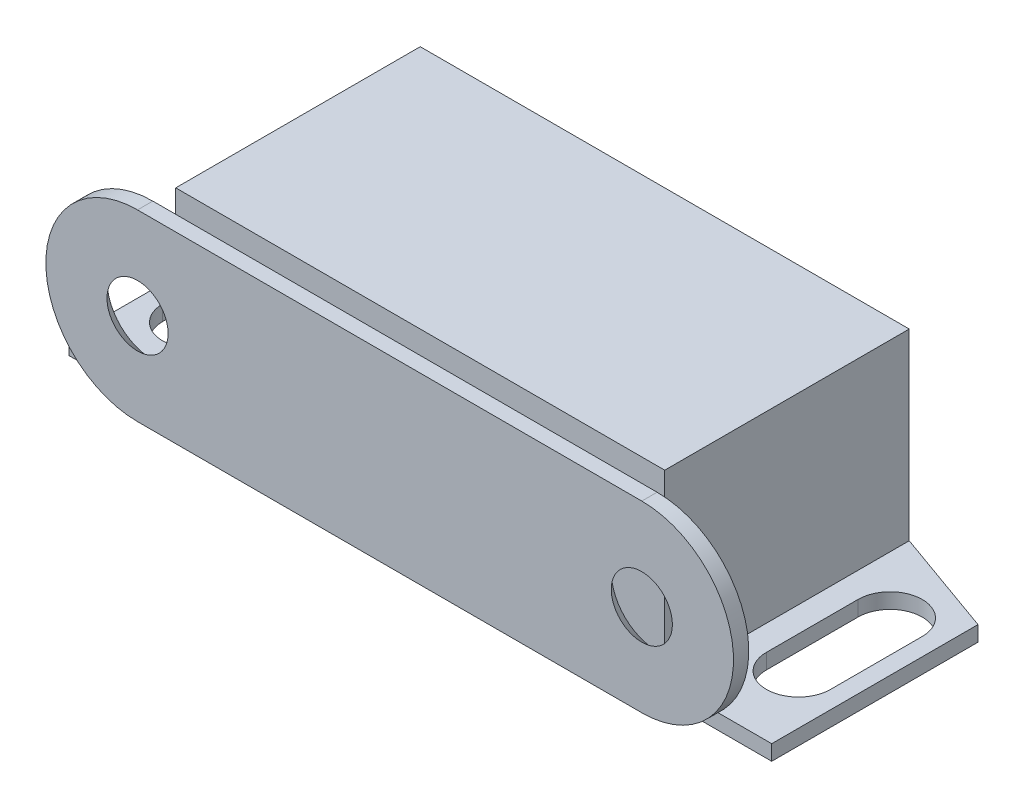
ISO-10303-21;
HEADER;
FILE_DESCRIPTION(('STEP AP214'),'2;1');
FILE_NAME('part.step','',(''),(''),'','','');
FILE_SCHEMA(('AUTOMOTIVE_DESIGN { 1 0 10303 214 1 1 1 1 }'));
ENDSEC;
DATA;
#1=APPLICATION_CONTEXT('core data for automotive mechanical design processes');
#2=APPLICATION_PROTOCOL_DEFINITION('international standard','automotive_design',2000,#1);
#3=PRODUCT_CONTEXT('',#1,'mechanical');
#4=PRODUCT('Part','Part','',(#3));
#5=PRODUCT_RELATED_PRODUCT_CATEGORY('part','',(#4));
#6=PRODUCT_DEFINITION_FORMATION('','',#4);
#7=PRODUCT_DEFINITION_CONTEXT('part definition',#1,'design');
#8=PRODUCT_DEFINITION('design','',#6,#7);
#9=PRODUCT_DEFINITION_SHAPE('','',#8);
#10=(LENGTH_UNIT() NAMED_UNIT(*) SI_UNIT(.MILLI.,.METRE.));
#11=(NAMED_UNIT(*) PLANE_ANGLE_UNIT() SI_UNIT($,.RADIAN.));
#12=(NAMED_UNIT(*) SI_UNIT($,.STERADIAN.) SOLID_ANGLE_UNIT());
#13=UNCERTAINTY_MEASURE_WITH_UNIT(LENGTH_MEASURE(1.E-05),#10,'distance_accuracy_value','');
#14=(GEOMETRIC_REPRESENTATION_CONTEXT(3) GLOBAL_UNCERTAINTY_ASSIGNED_CONTEXT((#13)) GLOBAL_UNIT_ASSIGNED_CONTEXT((#10,
#11,#12)) REPRESENTATION_CONTEXT('',''));
#15=CARTESIAN_POINT('',(0.,0.,0.));
#16=DIRECTION('',(0.,0.,1.));
#17=DIRECTION('',(1.,0.,0.));
#18=AXIS2_PLACEMENT_3D('',#15,#16,#17);
#19=CARTESIAN_POINT('',(6.5,6.5,2.));
#20=DIRECTION('',(0.,0.,1.));
#21=DIRECTION('',(1.,0.,0.));
#22=AXIS2_PLACEMENT_3D('',#19,#20,#21);
#23=PLANE('',#22);
#24=CARTESIAN_POINT('',(6.5,6.5,2.));
#25=DIRECTION('',(0.,0.,1.));
#26=DIRECTION('',(1.,0.,0.));
#27=AXIS2_PLACEMENT_3D('',#24,#25,#26);
#28=CIRCLE('',#27,2.);
#29=CARTESIAN_POINT('',(8.5,6.5,2.));
#30=VERTEX_POINT('',#29);
#31=EDGE_CURVE('E127',#30,#30,#28,.T.);
#32=ORIENTED_EDGE('',*,*,#31,.F.);
#33=EDGE_LOOP('',(#32));
#34=FACE_BOUND('',#33,.T.);
#35=CARTESIAN_POINT('',(6.5,6.5,2.));
#36=DIRECTION('',(0.,0.,1.));
#37=DIRECTION('',(1.,0.,0.));
#38=AXIS2_PLACEMENT_3D('',#35,#36,#37);
#39=CIRCLE('',#38,6.);
#40=CARTESIAN_POINT('',(6.5,12.5,2.));
#41=VERTEX_POINT('',#40);
#42=CARTESIAN_POINT('',(6.5,0.499999999999999,2.));
#43=VERTEX_POINT('',#42);
#44=EDGE_CURVE('E109',#41,#43,#39,.T.);
#45=ORIENTED_EDGE('',*,*,#44,.T.);
#46=DIRECTION('',(1.,0.,0.));
#47=VECTOR('',#46,1.);
#48=CARTESIAN_POINT('',(6.5,0.499999999999999,2.));
#49=LINE('',#48,#47);
#50=CARTESIAN_POINT('',(39.5,0.500000000000001,2.));
#51=VERTEX_POINT('',#50);
#52=EDGE_CURVE('E104',#43,#51,#49,.T.);
#53=ORIENTED_EDGE('',*,*,#52,.T.);
#54=CARTESIAN_POINT('',(39.5,6.5,2.));
#55=DIRECTION('',(0.,0.,1.));
#56=DIRECTION('',(1.,0.,0.));
#57=AXIS2_PLACEMENT_3D('',#54,#55,#56);
#58=CIRCLE('',#57,6.);
#59=CARTESIAN_POINT('',(39.5,12.5,2.));
#60=VERTEX_POINT('',#59);
#61=EDGE_CURVE('E107',#51,#60,#58,.T.);
#62=ORIENTED_EDGE('',*,*,#61,.T.);
#63=DIRECTION('',(-1.,0.,0.));
#64=VECTOR('',#63,1.);
#65=CARTESIAN_POINT('',(6.5,12.5,2.));
#66=LINE('',#65,#64);
#67=EDGE_CURVE('E73',#60,#41,#66,.T.);
#68=ORIENTED_EDGE('',*,*,#67,.T.);
#69=EDGE_LOOP('',(#45,#53,#62,#68));
#70=FACE_BOUND('',#69,.T.);
#71=CARTESIAN_POINT('',(39.5,6.5,2.));
#72=DIRECTION('',(0.,0.,1.));
#73=DIRECTION('',(1.,0.,0.));
#74=AXIS2_PLACEMENT_3D('',#71,#72,#73);
#75=CIRCLE('',#74,2.);
#76=CARTESIAN_POINT('',(41.5,6.5,2.));
#77=VERTEX_POINT('',#76);
#78=EDGE_CURVE('E178',#77,#77,#75,.T.);
#79=ORIENTED_EDGE('',*,*,#78,.F.);
#80=EDGE_LOOP('',(#79));
#81=FACE_BOUND('',#80,.T.);
#82=ADVANCED_FACE('F55',(#34,#70,#81),#23,.T.);
#83=CARTESIAN_POINT('',(6.5,6.5,1.));
#84=DIRECTION('',(0.,0.,1.));
#85=DIRECTION('',(1.,0.,0.));
#86=AXIS2_PLACEMENT_3D('',#83,#84,#85);
#87=PLANE('',#86);
#88=CARTESIAN_POINT('',(6.5,6.5,1.));
#89=DIRECTION('',(0.,0.,1.));
#90=DIRECTION('',(1.,0.,0.));
#91=AXIS2_PLACEMENT_3D('',#88,#89,#90);
#92=CIRCLE('',#91,3.);
#93=CARTESIAN_POINT('',(9.5,6.5,1.));
#94=VERTEX_POINT('',#93);
#95=EDGE_CURVE('E12',#94,#94,#92,.T.);
#96=ORIENTED_EDGE('',*,*,#95,.T.);
#97=EDGE_LOOP('',(#96));
#98=FACE_BOUND('',#97,.T.);
#99=CARTESIAN_POINT('',(39.5,6.5,1.));
#100=DIRECTION('',(0.,0.,1.));
#101=DIRECTION('',(1.,0.,0.));
#102=AXIS2_PLACEMENT_3D('',#99,#100,#101);
#103=CIRCLE('',#102,3.00000000000001);
#104=CARTESIAN_POINT('',(42.5,6.5,1.));
#105=VERTEX_POINT('',#104);
#106=EDGE_CURVE('E65',#105,#105,#103,.T.);
#107=ORIENTED_EDGE('',*,*,#106,.T.);
#108=EDGE_LOOP('',(#107));
#109=FACE_BOUND('',#108,.T.);
#110=CARTESIAN_POINT('',(6.5,6.5,1.));
#111=DIRECTION('',(0.,0.,1.));
#112=DIRECTION('',(1.,0.,0.));
#113=AXIS2_PLACEMENT_3D('',#110,#111,#112);
#114=CIRCLE('',#113,6.);
#115=CARTESIAN_POINT('',(6.5,12.5,1.));
#116=VERTEX_POINT('',#115);
#117=CARTESIAN_POINT('',(6.5,0.499999999999999,1.));
#118=VERTEX_POINT('',#117);
#119=EDGE_CURVE('E124',#116,#118,#114,.T.);
#120=ORIENTED_EDGE('',*,*,#119,.F.);
#121=DIRECTION('',(-1.,0.,0.));
#122=VECTOR('',#121,1.);
#123=CARTESIAN_POINT('',(6.5,12.5,1.));
#124=LINE('',#123,#122);
#125=CARTESIAN_POINT('',(39.5,12.5,1.));
#126=VERTEX_POINT('',#125);
#127=EDGE_CURVE('E96',#126,#116,#124,.T.);
#128=ORIENTED_EDGE('',*,*,#127,.F.);
#129=CARTESIAN_POINT('',(39.5,6.5,1.));
#130=DIRECTION('',(0.,0.,1.));
#131=DIRECTION('',(1.,0.,0.));
#132=AXIS2_PLACEMENT_3D('',#129,#130,#131);
#133=CIRCLE('',#132,6.);
#134=CARTESIAN_POINT('',(39.5,0.500000000000001,1.));
#135=VERTEX_POINT('',#134);
#136=EDGE_CURVE('E90',#135,#126,#133,.T.);
#137=ORIENTED_EDGE('',*,*,#136,.F.);
#138=DIRECTION('',(1.,0.,0.));
#139=VECTOR('',#138,1.);
#140=CARTESIAN_POINT('',(6.5,0.499999999999999,1.));
#141=LINE('',#140,#139);
#142=EDGE_CURVE('E114',#118,#135,#141,.T.);
#143=ORIENTED_EDGE('',*,*,#142,.F.);
#144=EDGE_LOOP('',(#120,#128,#137,#143));
#145=FACE_BOUND('',#144,.T.);
#146=ADVANCED_FACE('F136',(#98,#109,#145),#87,.F.);
#147=CARTESIAN_POINT('',(6.5,6.5,2.));
#148=DIRECTION('',(0.,0.,-1.));
#149=DIRECTION('',(-1.,0.,0.));
#150=AXIS2_PLACEMENT_3D('',#147,#148,#149);
#151=CYLINDRICAL_SURFACE('',#150,6.);
#152=ORIENTED_EDGE('',*,*,#119,.T.);
#153=DIRECTION('',(0.,0.,-1.));
#154=VECTOR('',#153,1.);
#155=CARTESIAN_POINT('',(6.5,0.499999999999999,2.));
#156=LINE('',#155,#154);
#157=EDGE_CURVE('E115',#43,#118,#156,.T.);
#158=ORIENTED_EDGE('',*,*,#157,.F.);
#159=ORIENTED_EDGE('',*,*,#44,.F.);
#160=DIRECTION('',(0.,0.,-1.));
#161=VECTOR('',#160,1.);
#162=CARTESIAN_POINT('',(6.5,12.5,2.));
#163=LINE('',#162,#161);
#164=EDGE_CURVE('E120',#41,#116,#163,.T.);
#165=ORIENTED_EDGE('',*,*,#164,.T.);
#166=EDGE_LOOP('',(#152,#158,#159,#165));
#167=FACE_BOUND('',#166,.T.);
#168=ADVANCED_FACE('F154',(#167),#151,.T.);
#169=CARTESIAN_POINT('',(6.5,0.499999999999999,2.));
#170=DIRECTION('',(0.,1.,0.));
#171=DIRECTION('',(-1.,0.,0.));
#172=AXIS2_PLACEMENT_3D('',#169,#170,#171);
#173=PLANE('',#172);
#174=ORIENTED_EDGE('',*,*,#142,.T.);
#175=DIRECTION('',(0.,0.,-1.));
#176=VECTOR('',#175,1.);
#177=CARTESIAN_POINT('',(39.5,0.500000000000001,2.));
#178=LINE('',#177,#176);
#179=EDGE_CURVE('E112',#51,#135,#178,.T.);
#180=ORIENTED_EDGE('',*,*,#179,.F.);
#181=ORIENTED_EDGE('',*,*,#52,.F.);
#182=ORIENTED_EDGE('',*,*,#157,.T.);
#183=EDGE_LOOP('',(#174,#180,#181,#182));
#184=FACE_BOUND('',#183,.T.);
#185=ADVANCED_FACE('F113',(#184),#173,.F.);
#186=CARTESIAN_POINT('',(39.5,6.5,2.));
#187=DIRECTION('',(0.,0.,-1.));
#188=DIRECTION('',(-1.,0.,0.));
#189=AXIS2_PLACEMENT_3D('',#186,#187,#188);
#190=CYLINDRICAL_SURFACE('',#189,6.);
#191=ORIENTED_EDGE('',*,*,#136,.T.);
#192=DIRECTION('',(0.,0.,-1.));
#193=VECTOR('',#192,1.);
#194=CARTESIAN_POINT('',(39.5,12.5,2.));
#195=LINE('',#194,#193);
#196=EDGE_CURVE('E116',#60,#126,#195,.T.);
#197=ORIENTED_EDGE('',*,*,#196,.F.);
#198=ORIENTED_EDGE('',*,*,#61,.F.);
#199=ORIENTED_EDGE('',*,*,#179,.T.);
#200=EDGE_LOOP('',(#191,#197,#198,#199));
#201=FACE_BOUND('',#200,.T.);
#202=ADVANCED_FACE('F118',(#201),#190,.T.);
#203=CARTESIAN_POINT('',(6.5,12.5,2.));
#204=DIRECTION('',(0.,-1.,0.));
#205=DIRECTION('',(1.,0.,0.));
#206=AXIS2_PLACEMENT_3D('',#203,#204,#205);
#207=PLANE('',#206);
#208=ORIENTED_EDGE('',*,*,#127,.T.);
#209=ORIENTED_EDGE('',*,*,#164,.F.);
#210=ORIENTED_EDGE('',*,*,#67,.F.);
#211=ORIENTED_EDGE('',*,*,#196,.T.);
#212=EDGE_LOOP('',(#208,#209,#210,#211));
#213=FACE_BOUND('',#212,.T.);
#214=ADVANCED_FACE('F145',(#213),#207,.F.);
#215=CARTESIAN_POINT('',(6.5,6.5,1.));
#216=DIRECTION('',(0.,0.,-1.));
#217=DIRECTION('',(-1.,0.,0.));
#218=AXIS2_PLACEMENT_3D('',#215,#216,#217);
#219=CONICAL_SURFACE('',#218,3.,0.785398163397446);
#220=ORIENTED_EDGE('',*,*,#31,.T.);
#221=EDGE_LOOP('',(#220));
#222=FACE_BOUND('',#221,.T.);
#223=ORIENTED_EDGE('',*,*,#95,.F.);
#224=EDGE_LOOP('',(#223));
#225=FACE_BOUND('',#224,.T.);
#226=ADVANCED_FACE('F140',(#222,#225),#219,.F.);
#227=CARTESIAN_POINT('',(39.5,6.5,1.));
#228=DIRECTION('',(0.,0.,-1.));
#229=DIRECTION('',(-1.,0.,0.));
#230=AXIS2_PLACEMENT_3D('',#227,#228,#229);
#231=CONICAL_SURFACE('',#230,3.00000000000001,0.785398163397443);
#232=ORIENTED_EDGE('',*,*,#78,.T.);
#233=EDGE_LOOP('',(#232));
#234=FACE_BOUND('',#233,.T.);
#235=ORIENTED_EDGE('',*,*,#106,.F.);
#236=EDGE_LOOP('',(#235));
#237=FACE_BOUND('',#236,.T.);
#238=ADVANCED_FACE('F58',(#234,#237),#231,.F.);
#239=CLOSED_SHELL('',(#82,#146,#168,#185,#202,#214,#226,#238));
#240=MANIFOLD_SOLID_BREP('B2',#239);
#241=CARTESIAN_POINT('',(0.,0.,0.));
#242=DIRECTION('',(0.,0.,1.));
#243=DIRECTION('',(1.,0.,0.));
#244=AXIS2_PLACEMENT_3D('',#241,#242,#243);
#245=PLANE('',#244);
#246=DIRECTION('',(1.,0.,0.));
#247=VECTOR('',#246,1.);
#248=CARTESIAN_POINT('',(0.,0.,0.));
#249=LINE('',#248,#247);
#250=CARTESIAN_POINT('',(0.,0.,0.));
#251=VERTEX_POINT('',#250);
#252=CARTESIAN_POINT('',(46.,0.,0.));
#253=VERTEX_POINT('',#252);
#254=EDGE_CURVE('E569',#251,#253,#249,.T.);
#255=ORIENTED_EDGE('',*,*,#254,.T.);
#256=DIRECTION('',(0.,-1.,0.));
#257=VECTOR('',#256,1.);
#258=CARTESIAN_POINT('',(46.,0.,0.));
#259=LINE('',#258,#257);
#260=CARTESIAN_POINT('',(46.,1.,0.));
#261=VERTEX_POINT('',#260);
#262=EDGE_CURVE('E589',#261,#253,#259,.T.);
#263=ORIENTED_EDGE('',*,*,#262,.F.);
#264=DIRECTION('',(1.,0.,0.));
#265=VECTOR('',#264,1.);
#266=CARTESIAN_POINT('',(0.,1.00000000000004,0.));
#267=LINE('',#266,#265);
#268=CARTESIAN_POINT('',(39.,1.00000000000001,0.));
#269=VERTEX_POINT('',#268);
#270=EDGE_CURVE('E593',#269,#261,#267,.T.);
#271=ORIENTED_EDGE('',*,*,#270,.F.);
#272=DIRECTION('',(0.,-1.,0.));
#273=VECTOR('',#272,1.);
#274=CARTESIAN_POINT('',(39.,0.,0.));
#275=LINE('',#274,#273);
#276=CARTESIAN_POINT('',(39.,13.,0.));
#277=VERTEX_POINT('',#276);
#278=EDGE_CURVE('E597',#277,#269,#275,.T.);
#279=ORIENTED_EDGE('',*,*,#278,.F.);
#280=DIRECTION('',(1.,0.,0.));
#281=VECTOR('',#280,1.);
#282=CARTESIAN_POINT('',(0.,13.,0.));
#283=LINE('',#282,#281);
#284=CARTESIAN_POINT('',(7.,13.,0.));
#285=VERTEX_POINT('',#284);
#286=EDGE_CURVE('E600',#285,#277,#283,.T.);
#287=ORIENTED_EDGE('',*,*,#286,.F.);
#288=DIRECTION('',(0.,1.,0.));
#289=VECTOR('',#288,1.);
#290=CARTESIAN_POINT('',(7.,0.,0.));
#291=LINE('',#290,#289);
#292=CARTESIAN_POINT('',(7.,1.,0.));
#293=VERTEX_POINT('',#292);
#294=EDGE_CURVE('E603',#293,#285,#291,.T.);
#295=ORIENTED_EDGE('',*,*,#294,.F.);
#296=DIRECTION('',(1.,0.,0.));
#297=VECTOR('',#296,1.);
#298=CARTESIAN_POINT('',(0.,1.,0.));
#299=LINE('',#298,#297);
#300=CARTESIAN_POINT('',(0.,1.,0.));
#301=VERTEX_POINT('',#300);
#302=EDGE_CURVE('E606',#301,#293,#299,.T.);
#303=ORIENTED_EDGE('',*,*,#302,.F.);
#304=DIRECTION('',(0.,1.,0.));
#305=VECTOR('',#304,1.);
#306=CARTESIAN_POINT('',(0.,0.,0.));
#307=LINE('',#306,#305);
#308=EDGE_CURVE('E575',#251,#301,#307,.T.);
#309=ORIENTED_EDGE('',*,*,#308,.F.);
#310=EDGE_LOOP('',(#255,#263,#271,#279,#287,#295,#303,#309));
#311=FACE_BOUND('',#310,.T.);
#312=DIRECTION('',(-1.,0.,0.));
#313=VECTOR('',#312,1.);
#314=CARTESIAN_POINT('',(12.,10.,0.));
#315=LINE('',#314,#313);
#316=CARTESIAN_POINT('',(34.,10.,0.));
#317=VERTEX_POINT('',#316);
#318=CARTESIAN_POINT('',(12.,10.,0.));
#319=VERTEX_POINT('',#318);
#320=EDGE_CURVE('E429',#317,#319,#315,.T.);
#321=ORIENTED_EDGE('',*,*,#320,.F.);
#322=DIRECTION('',(0.,1.,0.));
#323=VECTOR('',#322,1.);
#324=CARTESIAN_POINT('',(34.,9.,0.));
#325=LINE('',#324,#323);
#326=CARTESIAN_POINT('',(34.,9.,0.));
#327=VERTEX_POINT('',#326);
#328=EDGE_CURVE('E424',#327,#317,#325,.T.);
#329=ORIENTED_EDGE('',*,*,#328,.F.);
#330=DIRECTION('',(1.,0.,0.));
#331=VECTOR('',#330,1.);
#332=CARTESIAN_POINT('',(12.,9.,0.));
#333=LINE('',#332,#331);
#334=CARTESIAN_POINT('',(12.,9.,0.));
#335=VERTEX_POINT('',#334);
#336=EDGE_CURVE('E439',#335,#327,#333,.T.);
#337=ORIENTED_EDGE('',*,*,#336,.F.);
#338=DIRECTION('',(0.,-1.,0.));
#339=VECTOR('',#338,1.);
#340=CARTESIAN_POINT('',(12.,9.,0.));
#341=LINE('',#340,#339);
#342=EDGE_CURVE('E451',#319,#335,#341,.T.);
#343=ORIENTED_EDGE('',*,*,#342,.F.);
#344=EDGE_LOOP('',(#321,#329,#337,#343));
#345=FACE_BOUND('',#344,.T.);
#346=DIRECTION('',(-1.,0.,0.));
#347=VECTOR('',#346,1.);
#348=CARTESIAN_POINT('',(12.,5.,0.));
#349=LINE('',#348,#347);
#350=CARTESIAN_POINT('',(34.,5.,0.));
#351=VERTEX_POINT('',#350);
#352=CARTESIAN_POINT('',(12.,5.,0.));
#353=VERTEX_POINT('',#352);
#354=EDGE_CURVE('E1013',#351,#353,#349,.T.);
#355=ORIENTED_EDGE('',*,*,#354,.F.);
#356=DIRECTION('',(0.,1.,0.));
#357=VECTOR('',#356,1.);
#358=CARTESIAN_POINT('',(34.,4.,0.));
#359=LINE('',#358,#357);
#360=CARTESIAN_POINT('',(34.,4.,0.));
#361=VERTEX_POINT('',#360);
#362=EDGE_CURVE('E421',#361,#351,#359,.T.);
#363=ORIENTED_EDGE('',*,*,#362,.F.);
#364=DIRECTION('',(1.,0.,0.));
#365=VECTOR('',#364,1.);
#366=CARTESIAN_POINT('',(12.,4.,0.));
#367=LINE('',#366,#365);
#368=CARTESIAN_POINT('',(12.,4.,0.));
#369=VERTEX_POINT('',#368);
#370=EDGE_CURVE('E417',#369,#361,#367,.T.);
#371=ORIENTED_EDGE('',*,*,#370,.F.);
#372=DIRECTION('',(0.,-1.,0.));
#373=VECTOR('',#372,1.);
#374=CARTESIAN_POINT('',(12.,4.,0.));
#375=LINE('',#374,#373);
#376=EDGE_CURVE('E1009',#353,#369,#375,.T.);
#377=ORIENTED_EDGE('',*,*,#376,.F.);
#378=EDGE_LOOP('',(#355,#363,#371,#377));
#379=FACE_BOUND('',#378,.T.);
#380=ADVANCED_FACE('F227',(#311,#345,#379),#245,.T.);
#381=CARTESIAN_POINT('',(0.,0.,-16.));
#382=DIRECTION('',(0.,-1.,0.));
#383=DIRECTION('',(0.,0.,-1.));
#384=AXIS2_PLACEMENT_3D('',#381,#382,#383);
#385=PLANE('',#384);
#386=DIRECTION('',(-0.941741911594838,0.,-0.336336396998156));
#387=VECTOR('',#386,1.);
#388=CARTESIAN_POINT('',(4.41176470588234,0.,-28.3529411764706));
#389=LINE('',#388,#387);
#390=CARTESIAN_POINT('',(46.,0.,-13.5));
#391=VERTEX_POINT('',#390);
#392=CARTESIAN_POINT('',(39.,0.,-16.));
#393=VERTEX_POINT('',#392);
#394=EDGE_CURVE('E484',#391,#393,#389,.T.);
#395=ORIENTED_EDGE('',*,*,#394,.F.);
#396=DIRECTION('',(0.,0.,1.));
#397=VECTOR('',#396,1.);
#398=CARTESIAN_POINT('',(46.,0.,-16.));
#399=LINE('',#398,#397);
#400=EDGE_CURVE('E585',#391,#253,#399,.T.);
#401=ORIENTED_EDGE('',*,*,#400,.T.);
#402=ORIENTED_EDGE('',*,*,#254,.F.);
#403=DIRECTION('',(0.,0.,1.));
#404=VECTOR('',#403,1.);
#405=CARTESIAN_POINT('',(0.,0.,-16.));
#406=LINE('',#405,#404);
#407=CARTESIAN_POINT('',(0.,0.,-13.5));
#408=VERTEX_POINT('',#407);
#409=EDGE_CURVE('E612',#408,#251,#406,.T.);
#410=ORIENTED_EDGE('',*,*,#409,.F.);
#411=DIRECTION('',(-0.941741911594838,0.,0.336336396998156));
#412=VECTOR('',#411,1.);
#413=CARTESIAN_POINT('',(0.791855203619906,0.,-13.7828054298643));
#414=LINE('',#413,#412);
#415=CARTESIAN_POINT('',(6.99999999999999,0.,-16.));
#416=VERTEX_POINT('',#415);
#417=EDGE_CURVE('E477',#416,#408,#414,.T.);
#418=ORIENTED_EDGE('',*,*,#417,.F.);
#419=DIRECTION('',(1.,0.,0.));
#420=VECTOR('',#419,1.);
#421=CARTESIAN_POINT('',(0.,0.,-16.));
#422=LINE('',#421,#420);
#423=EDGE_CURVE('E570',#416,#393,#422,.T.);
#424=ORIENTED_EDGE('',*,*,#423,.T.);
#425=EDGE_LOOP('',(#395,#401,#402,#410,#418,#424));
#426=FACE_BOUND('',#425,.T.);
#427=CARTESIAN_POINT('',(42.75,0.,-5.));
#428=DIRECTION('',(0.,-1.,0.));
#429=DIRECTION('',(0.,0.,-1.));
#430=AXIS2_PLACEMENT_3D('',#427,#428,#429);
#431=CIRCLE('',#430,2.1);
#432=CARTESIAN_POINT('',(44.85,0.,-5.));
#433=VERTEX_POINT('',#432);
#434=CARTESIAN_POINT('',(40.65,0.,-5.));
#435=VERTEX_POINT('',#434);
#436=EDGE_CURVE('E553',#433,#435,#431,.T.);
#437=ORIENTED_EDGE('',*,*,#436,.F.);
#438=DIRECTION('',(0.,0.,1.));
#439=VECTOR('',#438,1.);
#440=CARTESIAN_POINT('',(44.85,0.,-16.));
#441=LINE('',#440,#439);
#442=CARTESIAN_POINT('',(44.85,0.,-11.));
#443=VERTEX_POINT('',#442);
#444=EDGE_CURVE('E508',#443,#433,#441,.T.);
#445=ORIENTED_EDGE('',*,*,#444,.F.);
#446=CARTESIAN_POINT('',(42.75,0.,-11.));
#447=DIRECTION('',(0.,-1.,0.));
#448=DIRECTION('',(0.,0.,-1.));
#449=AXIS2_PLACEMENT_3D('',#446,#447,#448);
#450=CIRCLE('',#449,2.1);
#451=CARTESIAN_POINT('',(40.65,0.,-11.));
#452=VERTEX_POINT('',#451);
#453=EDGE_CURVE('E546',#452,#443,#450,.T.);
#454=ORIENTED_EDGE('',*,*,#453,.F.);
#455=DIRECTION('',(0.,0.,-1.));
#456=VECTOR('',#455,1.);
#457=CARTESIAN_POINT('',(40.65,0.,-16.));
#458=LINE('',#457,#456);
#459=EDGE_CURVE('E550',#435,#452,#458,.T.);
#460=ORIENTED_EDGE('',*,*,#459,.F.);
#461=EDGE_LOOP('',(#437,#445,#454,#460));
#462=FACE_BOUND('',#461,.T.);
#463=CARTESIAN_POINT('',(3.24999999999999,0.,-5.));
#464=DIRECTION('',(0.,-1.,0.));
#465=DIRECTION('',(0.,0.,-1.));
#466=AXIS2_PLACEMENT_3D('',#463,#464,#465);
#467=CIRCLE('',#466,2.1);
#468=CARTESIAN_POINT('',(5.34999999999999,0.,-5.));
#469=VERTEX_POINT('',#468);
#470=CARTESIAN_POINT('',(1.14999999999999,0.,-5.));
#471=VERTEX_POINT('',#470);
#472=EDGE_CURVE('E566',#469,#471,#467,.T.);
#473=ORIENTED_EDGE('',*,*,#472,.F.);
#474=DIRECTION('',(0.,0.,1.));
#475=VECTOR('',#474,1.);
#476=CARTESIAN_POINT('',(5.34999999999999,0.,-16.));
#477=LINE('',#476,#475);
#478=CARTESIAN_POINT('',(5.34999999999999,0.,-11.));
#479=VERTEX_POINT('',#478);
#480=EDGE_CURVE('E556',#479,#469,#477,.T.);
#481=ORIENTED_EDGE('',*,*,#480,.F.);
#482=CARTESIAN_POINT('',(3.24999999999999,0.,-11.));
#483=DIRECTION('',(0.,-1.,0.));
#484=DIRECTION('',(0.,0.,-1.));
#485=AXIS2_PLACEMENT_3D('',#482,#483,#484);
#486=CIRCLE('',#485,2.1);
#487=CARTESIAN_POINT('',(1.14999999999999,0.,-11.));
#488=VERTEX_POINT('',#487);
#489=EDGE_CURVE('E559',#488,#479,#486,.T.);
#490=ORIENTED_EDGE('',*,*,#489,.F.);
#491=DIRECTION('',(0.,0.,-1.));
#492=VECTOR('',#491,1.);
#493=CARTESIAN_POINT('',(1.14999999999999,0.,-16.));
#494=LINE('',#493,#492);
#495=EDGE_CURVE('E563',#471,#488,#494,.T.);
#496=ORIENTED_EDGE('',*,*,#495,.F.);
#497=EDGE_LOOP('',(#473,#481,#490,#496));
#498=FACE_BOUND('',#497,.T.);
#499=ADVANCED_FACE('F229',(#426,#462,#498),#385,.T.);
#500=CARTESIAN_POINT('',(0.,0.,-16.));
#501=DIRECTION('',(1.,0.,0.));
#502=DIRECTION('',(0.,0.,-1.));
#503=AXIS2_PLACEMENT_3D('',#500,#501,#502);
#504=PLANE('',#503);
#505=DIRECTION('',(0.,0.,1.));
#506=VECTOR('',#505,1.);
#507=CARTESIAN_POINT('',(0.,1.,-16.));
#508=LINE('',#507,#506);
#509=CARTESIAN_POINT('',(0.,1.00000000000004,-13.5));
#510=VERTEX_POINT('',#509);
#511=EDGE_CURVE('E615',#510,#301,#508,.T.);
#512=ORIENTED_EDGE('',*,*,#511,.F.);
#513=DIRECTION('',(0.,1.,0.));
#514=VECTOR('',#513,1.);
#515=CARTESIAN_POINT('',(0.,-15.,-13.5));
#516=LINE('',#515,#514);
#517=EDGE_CURVE('E473',#408,#510,#516,.T.);
#518=ORIENTED_EDGE('',*,*,#517,.F.);
#519=ORIENTED_EDGE('',*,*,#409,.T.);
#520=ORIENTED_EDGE('',*,*,#308,.T.);
#521=EDGE_LOOP('',(#512,#518,#519,#520));
#522=FACE_BOUND('',#521,.T.);
#523=ADVANCED_FACE('F688',(#522),#504,.F.);
#524=CARTESIAN_POINT('',(0.,1.,-16.));
#525=DIRECTION('',(0.,-1.,0.));
#526=DIRECTION('',(0.,0.,-1.));
#527=AXIS2_PLACEMENT_3D('',#524,#525,#526);
#528=PLANE('',#527);
#529=DIRECTION('',(0.,0.,-1.));
#530=VECTOR('',#529,1.);
#531=CARTESIAN_POINT('',(5.34999999999999,1.00000000000003,-5.));
#532=LINE('',#531,#530);
#533=CARTESIAN_POINT('',(5.34999999999999,1.,-5.));
#534=VERTEX_POINT('',#533);
#535=CARTESIAN_POINT('',(5.34999999999999,1.00000000000003,-11.));
#536=VERTEX_POINT('',#535);
#537=EDGE_CURVE('E520',#534,#536,#532,.T.);
#538=ORIENTED_EDGE('',*,*,#537,.F.);
#539=CARTESIAN_POINT('',(3.24999999999999,1.00000000000003,-5.));
#540=DIRECTION('',(0.,1.,0.));
#541=DIRECTION('',(1.,0.,0.));
#542=AXIS2_PLACEMENT_3D('',#539,#540,#541);
#543=CIRCLE('',#542,2.1);
#544=CARTESIAN_POINT('',(1.14999999999999,1.00000000000004,-5.));
#545=VERTEX_POINT('',#544);
#546=EDGE_CURVE('E487',#545,#534,#543,.T.);
#547=ORIENTED_EDGE('',*,*,#546,.F.);
#548=DIRECTION('',(0.,0.,1.));
#549=VECTOR('',#548,1.);
#550=CARTESIAN_POINT('',(1.14999999999999,1.00000000000004,-5.));
#551=LINE('',#550,#549);
#552=CARTESIAN_POINT('',(1.14999999999999,1.00000000000004,-11.));
#553=VERTEX_POINT('',#552);
#554=EDGE_CURVE('E528',#553,#545,#551,.T.);
#555=ORIENTED_EDGE('',*,*,#554,.F.);
#556=CARTESIAN_POINT('',(3.24999999999999,1.00000000000003,-11.));
#557=DIRECTION('',(0.,1.,0.));
#558=DIRECTION('',(1.,0.,0.));
#559=AXIS2_PLACEMENT_3D('',#556,#557,#558);
#560=CIRCLE('',#559,2.1);
#561=EDGE_CURVE('E524',#536,#553,#560,.T.);
#562=ORIENTED_EDGE('',*,*,#561,.F.);
#563=EDGE_LOOP('',(#538,#547,#555,#562));
#564=FACE_BOUND('',#563,.T.);
#565=DIRECTION('',(0.,0.,1.));
#566=VECTOR('',#565,1.);
#567=CARTESIAN_POINT('',(7.,1.,-16.));
#568=LINE('',#567,#566);
#569=CARTESIAN_POINT('',(7.,1.,-16.));
#570=VERTEX_POINT('',#569);
#571=EDGE_CURVE('E618',#570,#293,#568,.T.);
#572=ORIENTED_EDGE('',*,*,#571,.F.);
#573=DIRECTION('',(0.941741911594838,0.,-0.336336396998156));
#574=VECTOR('',#573,1.);
#575=CARTESIAN_POINT('',(6.99999999999999,1.00000000000003,-16.));
#576=LINE('',#575,#574);
#577=EDGE_CURVE('E468',#510,#570,#576,.T.);
#578=ORIENTED_EDGE('',*,*,#577,.F.);
#579=ORIENTED_EDGE('',*,*,#511,.T.);
#580=ORIENTED_EDGE('',*,*,#302,.T.);
#581=EDGE_LOOP('',(#572,#578,#579,#580));
#582=FACE_BOUND('',#581,.T.);
#583=ADVANCED_FACE('F650',(#564,#582),#528,.F.);
#584=CARTESIAN_POINT('',(7.,0.,-16.));
#585=DIRECTION('',(1.,0.,0.));
#586=DIRECTION('',(0.,0.,-1.));
#587=AXIS2_PLACEMENT_3D('',#584,#585,#586);
#588=PLANE('',#587);
#589=ORIENTED_EDGE('',*,*,#294,.T.);
#590=DIRECTION('',(0.,0.,1.));
#591=VECTOR('',#590,1.);
#592=CARTESIAN_POINT('',(7.,13.,-16.));
#593=LINE('',#592,#591);
#594=CARTESIAN_POINT('',(7.,13.,-16.));
#595=VERTEX_POINT('',#594);
#596=EDGE_CURVE('E622',#595,#285,#593,.T.);
#597=ORIENTED_EDGE('',*,*,#596,.F.);
#598=DIRECTION('',(0.,1.,0.));
#599=VECTOR('',#598,1.);
#600=CARTESIAN_POINT('',(7.,0.,-16.));
#601=LINE('',#600,#599);
#602=EDGE_CURVE('E582',#570,#595,#601,.T.);
#603=ORIENTED_EDGE('',*,*,#602,.F.);
#604=ORIENTED_EDGE('',*,*,#571,.T.);
#605=EDGE_LOOP('',(#589,#597,#603,#604));
#606=FACE_BOUND('',#605,.T.);
#607=ADVANCED_FACE('F655',(#606),#588,.F.);
#608=CARTESIAN_POINT('',(0.,13.,-16.));
#609=DIRECTION('',(0.,-1.,0.));
#610=DIRECTION('',(1.,0.,0.));
#611=AXIS2_PLACEMENT_3D('',#608,#609,#610);
#612=PLANE('',#611);
#613=ORIENTED_EDGE('',*,*,#286,.T.);
#614=DIRECTION('',(0.,0.,1.));
#615=VECTOR('',#614,1.);
#616=CARTESIAN_POINT('',(39.,13.,-16.));
#617=LINE('',#616,#615);
#618=CARTESIAN_POINT('',(39.,13.,-16.));
#619=VERTEX_POINT('',#618);
#620=EDGE_CURVE('E626',#619,#277,#617,.T.);
#621=ORIENTED_EDGE('',*,*,#620,.F.);
#622=DIRECTION('',(1.,0.,0.));
#623=VECTOR('',#622,1.);
#624=CARTESIAN_POINT('',(0.,13.,-16.));
#625=LINE('',#624,#623);
#626=EDGE_CURVE('E579',#595,#619,#625,.T.);
#627=ORIENTED_EDGE('',*,*,#626,.F.);
#628=ORIENTED_EDGE('',*,*,#596,.T.);
#629=EDGE_LOOP('',(#613,#621,#627,#628));
#630=FACE_BOUND('',#629,.T.);
#631=ADVANCED_FACE('F660',(#630),#612,.F.);
#632=CARTESIAN_POINT('',(39.,0.,-16.));
#633=DIRECTION('',(-1.,0.,0.));
#634=DIRECTION('',(0.,0.,1.));
#635=AXIS2_PLACEMENT_3D('',#632,#633,#634);
#636=PLANE('',#635);
#637=ORIENTED_EDGE('',*,*,#278,.T.);
#638=DIRECTION('',(0.,0.,1.));
#639=VECTOR('',#638,1.);
#640=CARTESIAN_POINT('',(39.,1.00000000000001,-16.));
#641=LINE('',#640,#639);
#642=CARTESIAN_POINT('',(39.,1.00000000000001,-16.));
#643=VERTEX_POINT('',#642);
#644=EDGE_CURVE('E630',#643,#269,#641,.T.);
#645=ORIENTED_EDGE('',*,*,#644,.F.);
#646=DIRECTION('',(0.,-1.,0.));
#647=VECTOR('',#646,1.);
#648=CARTESIAN_POINT('',(39.,0.,-16.));
#649=LINE('',#648,#647);
#650=EDGE_CURVE('E574',#619,#643,#649,.T.);
#651=ORIENTED_EDGE('',*,*,#650,.F.);
#652=ORIENTED_EDGE('',*,*,#620,.T.);
#653=EDGE_LOOP('',(#637,#645,#651,#652));
#654=FACE_BOUND('',#653,.T.);
#655=ADVANCED_FACE('F664',(#654),#636,.F.);
#656=CARTESIAN_POINT('',(0.,1.00000000000004,-16.));
#657=DIRECTION('',(0.,-1.,0.));
#658=DIRECTION('',(1.,0.,0.));
#659=AXIS2_PLACEMENT_3D('',#656,#657,#658);
#660=PLANE('',#659);
#661=DIRECTION('',(0.,0.,-1.));
#662=VECTOR('',#661,1.);
#663=CARTESIAN_POINT('',(44.85,1.,-5.));
#664=LINE('',#663,#662);
#665=CARTESIAN_POINT('',(44.85,1.,-5.));
#666=VERTEX_POINT('',#665);
#667=CARTESIAN_POINT('',(44.85,1.,-11.));
#668=VERTEX_POINT('',#667);
#669=EDGE_CURVE('E491',#666,#668,#664,.T.);
#670=ORIENTED_EDGE('',*,*,#669,.F.);
#671=CARTESIAN_POINT('',(42.75,1.,-5.));
#672=DIRECTION('',(0.,1.,0.));
#673=DIRECTION('',(-1.,0.,0.));
#674=AXIS2_PLACEMENT_3D('',#671,#672,#673);
#675=CIRCLE('',#674,2.1);
#676=CARTESIAN_POINT('',(40.65,1.,-5.));
#677=VERTEX_POINT('',#676);
#678=EDGE_CURVE('E488',#677,#666,#675,.T.);
#679=ORIENTED_EDGE('',*,*,#678,.F.);
#680=DIRECTION('',(0.,0.,1.));
#681=VECTOR('',#680,1.);
#682=CARTESIAN_POINT('',(40.65,1.,-5.));
#683=LINE('',#682,#681);
#684=CARTESIAN_POINT('',(40.65,1.,-11.));
#685=VERTEX_POINT('',#684);
#686=EDGE_CURVE('E500',#685,#677,#683,.T.);
#687=ORIENTED_EDGE('',*,*,#686,.F.);
#688=CARTESIAN_POINT('',(42.75,1.,-11.));
#689=DIRECTION('',(0.,1.,0.));
#690=DIRECTION('',(-1.,0.,0.));
#691=AXIS2_PLACEMENT_3D('',#688,#689,#690);
#692=CIRCLE('',#691,2.1);
#693=EDGE_CURVE('E496',#668,#685,#692,.T.);
#694=ORIENTED_EDGE('',*,*,#693,.F.);
#695=EDGE_LOOP('',(#670,#679,#687,#694));
#696=FACE_BOUND('',#695,.T.);
#697=DIRECTION('',(0.,0.,1.));
#698=VECTOR('',#697,1.);
#699=CARTESIAN_POINT('',(46.,1.,-16.));
#700=LINE('',#699,#698);
#701=CARTESIAN_POINT('',(46.,1.,-13.5));
#702=VERTEX_POINT('',#701);
#703=EDGE_CURVE('E634',#702,#261,#700,.T.);
#704=ORIENTED_EDGE('',*,*,#703,.F.);
#705=DIRECTION('',(0.941741911594838,0.,0.336336396998156));
#706=VECTOR('',#705,1.);
#707=CARTESIAN_POINT('',(39.,1.00000000000001,-16.));
#708=LINE('',#707,#706);
#709=EDGE_CURVE('E469',#643,#702,#708,.T.);
#710=ORIENTED_EDGE('',*,*,#709,.F.);
#711=ORIENTED_EDGE('',*,*,#644,.T.);
#712=ORIENTED_EDGE('',*,*,#270,.T.);
#713=EDGE_LOOP('',(#704,#710,#711,#712));
#714=FACE_BOUND('',#713,.T.);
#715=ADVANCED_FACE('F670',(#696,#714),#660,.F.);
#716=CARTESIAN_POINT('',(46.,0.,-16.));
#717=DIRECTION('',(-1.,0.,0.));
#718=DIRECTION('',(0.,0.,1.));
#719=AXIS2_PLACEMENT_3D('',#716,#717,#718);
#720=PLANE('',#719);
#721=ORIENTED_EDGE('',*,*,#400,.F.);
#722=DIRECTION('',(0.,1.,0.));
#723=VECTOR('',#722,1.);
#724=CARTESIAN_POINT('',(46.,-15.,-13.5));
#725=LINE('',#724,#723);
#726=EDGE_CURVE('E472',#391,#702,#725,.T.);
#727=ORIENTED_EDGE('',*,*,#726,.T.);
#728=ORIENTED_EDGE('',*,*,#703,.T.);
#729=ORIENTED_EDGE('',*,*,#262,.T.);
#730=EDGE_LOOP('',(#721,#727,#728,#729));
#731=FACE_BOUND('',#730,.T.);
#732=ADVANCED_FACE('F678',(#731),#720,.F.);
#733=CARTESIAN_POINT('',(0.,0.,-16.));
#734=DIRECTION('',(0.,0.,1.));
#735=DIRECTION('',(1.,0.,0.));
#736=AXIS2_PLACEMENT_3D('',#733,#734,#735);
#737=PLANE('',#736);
#738=ORIENTED_EDGE('',*,*,#650,.T.);
#739=DIRECTION('',(0.,-1.,0.));
#740=VECTOR('',#739,1.);
#741=CARTESIAN_POINT('',(39.,0.,-16.));
#742=LINE('',#741,#740);
#743=EDGE_CURVE('E53',#643,#393,#742,.T.);
#744=ORIENTED_EDGE('',*,*,#743,.T.);
#745=ORIENTED_EDGE('',*,*,#423,.F.);
#746=DIRECTION('',(0.,1.,0.));
#747=VECTOR('',#746,1.);
#748=CARTESIAN_POINT('',(6.99999999999999,0.,-16.));
#749=LINE('',#748,#747);
#750=EDGE_CURVE('E236',#416,#570,#749,.T.);
#751=ORIENTED_EDGE('',*,*,#750,.T.);
#752=ORIENTED_EDGE('',*,*,#602,.T.);
#753=ORIENTED_EDGE('',*,*,#626,.T.);
#754=EDGE_LOOP('',(#738,#744,#745,#751,#752,#753));
#755=FACE_BOUND('',#754,.T.);
#756=ADVANCED_FACE('F643',(#755),#737,.F.);
#757=CARTESIAN_POINT('',(42.75,-15.,-5.));
#758=DIRECTION('',(0.,1.,0.));
#759=DIRECTION('',(-1.,0.,0.));
#760=AXIS2_PLACEMENT_3D('',#757,#758,#759);
#761=CYLINDRICAL_SURFACE('',#760,2.1);
#762=ORIENTED_EDGE('',*,*,#436,.T.);
#763=DIRECTION('',(0.,1.,0.));
#764=VECTOR('',#763,1.);
#765=CARTESIAN_POINT('',(40.65,-15.,-5.));
#766=LINE('',#765,#764);
#767=EDGE_CURVE('E505',#435,#677,#766,.T.);
#768=ORIENTED_EDGE('',*,*,#767,.T.);
#769=ORIENTED_EDGE('',*,*,#678,.T.);
#770=DIRECTION('',(0.,1.,0.));
#771=VECTOR('',#770,1.);
#772=CARTESIAN_POINT('',(44.85,-15.,-5.));
#773=LINE('',#772,#771);
#774=EDGE_CURVE('E504',#433,#666,#773,.T.);
#775=ORIENTED_EDGE('',*,*,#774,.F.);
#776=EDGE_LOOP('',(#762,#768,#769,#775));
#777=FACE_BOUND('',#776,.T.);
#778=ADVANCED_FACE('F704',(#777),#761,.F.);
#779=CARTESIAN_POINT('',(40.65,-15.,-5.));
#780=DIRECTION('',(-1.,0.,0.));
#781=DIRECTION('',(0.,-1.,0.));
#782=AXIS2_PLACEMENT_3D('',#779,#780,#781);
#783=PLANE('',#782);
#784=ORIENTED_EDGE('',*,*,#459,.T.);
#785=DIRECTION('',(0.,1.,0.));
#786=VECTOR('',#785,1.);
#787=CARTESIAN_POINT('',(40.65,-15.,-11.));
#788=LINE('',#787,#786);
#789=EDGE_CURVE('E509',#452,#685,#788,.T.);
#790=ORIENTED_EDGE('',*,*,#789,.T.);
#791=ORIENTED_EDGE('',*,*,#686,.T.);
#792=ORIENTED_EDGE('',*,*,#767,.F.);
#793=EDGE_LOOP('',(#784,#790,#791,#792));
#794=FACE_BOUND('',#793,.T.);
#795=ADVANCED_FACE('F724',(#794),#783,.F.);
#796=CARTESIAN_POINT('',(42.75,-15.,-11.));
#797=DIRECTION('',(0.,1.,0.));
#798=DIRECTION('',(-1.,0.,0.));
#799=AXIS2_PLACEMENT_3D('',#796,#797,#798);
#800=CYLINDRICAL_SURFACE('',#799,2.1);
#801=ORIENTED_EDGE('',*,*,#453,.T.);
#802=DIRECTION('',(0.,1.,0.));
#803=VECTOR('',#802,1.);
#804=CARTESIAN_POINT('',(44.85,-15.,-11.));
#805=LINE('',#804,#803);
#806=EDGE_CURVE('E512',#443,#668,#805,.T.);
#807=ORIENTED_EDGE('',*,*,#806,.T.);
#808=ORIENTED_EDGE('',*,*,#693,.T.);
#809=ORIENTED_EDGE('',*,*,#789,.F.);
#810=EDGE_LOOP('',(#801,#807,#808,#809));
#811=FACE_BOUND('',#810,.T.);
#812=ADVANCED_FACE('F728',(#811),#800,.F.);
#813=CARTESIAN_POINT('',(44.85,-15.,-5.));
#814=DIRECTION('',(1.,0.,0.));
#815=DIRECTION('',(0.,1.,0.));
#816=AXIS2_PLACEMENT_3D('',#813,#814,#815);
#817=PLANE('',#816);
#818=ORIENTED_EDGE('',*,*,#444,.T.);
#819=ORIENTED_EDGE('',*,*,#774,.T.);
#820=ORIENTED_EDGE('',*,*,#669,.T.);
#821=ORIENTED_EDGE('',*,*,#806,.F.);
#822=EDGE_LOOP('',(#818,#819,#820,#821));
#823=FACE_BOUND('',#822,.T.);
#824=ADVANCED_FACE('F709',(#823),#817,.F.);
#825=CARTESIAN_POINT('',(3.24999999999997,-15.,-5.));
#826=DIRECTION('',(0.,1.,0.));
#827=DIRECTION('',(-1.,0.,0.));
#828=AXIS2_PLACEMENT_3D('',#825,#826,#827);
#829=CYLINDRICAL_SURFACE('',#828,2.1);
#830=ORIENTED_EDGE('',*,*,#472,.T.);
#831=DIRECTION('',(0.,1.,0.));
#832=VECTOR('',#831,1.);
#833=CARTESIAN_POINT('',(1.14999999999997,-15.,-5.));
#834=LINE('',#833,#832);
#835=EDGE_CURVE('E492',#471,#545,#834,.T.);
#836=ORIENTED_EDGE('',*,*,#835,.T.);
#837=ORIENTED_EDGE('',*,*,#546,.T.);
#838=DIRECTION('',(0.,1.,0.));
#839=VECTOR('',#838,1.);
#840=CARTESIAN_POINT('',(5.34999999999997,-15.,-5.));
#841=LINE('',#840,#839);
#842=EDGE_CURVE('E532',#469,#534,#841,.T.);
#843=ORIENTED_EDGE('',*,*,#842,.F.);
#844=EDGE_LOOP('',(#830,#836,#837,#843));
#845=FACE_BOUND('',#844,.T.);
#846=ADVANCED_FACE('F705',(#845),#829,.F.);
#847=CARTESIAN_POINT('',(1.14999999999997,-15.,-5.));
#848=DIRECTION('',(-1.,0.,0.));
#849=DIRECTION('',(0.,-1.,0.));
#850=AXIS2_PLACEMENT_3D('',#847,#848,#849);
#851=PLANE('',#850);
#852=ORIENTED_EDGE('',*,*,#495,.T.);
#853=DIRECTION('',(0.,1.,0.));
#854=VECTOR('',#853,1.);
#855=CARTESIAN_POINT('',(1.14999999999997,-15.,-11.));
#856=LINE('',#855,#854);
#857=EDGE_CURVE('E535',#488,#553,#856,.T.);
#858=ORIENTED_EDGE('',*,*,#857,.T.);
#859=ORIENTED_EDGE('',*,*,#554,.T.);
#860=ORIENTED_EDGE('',*,*,#835,.F.);
#861=EDGE_LOOP('',(#852,#858,#859,#860));
#862=FACE_BOUND('',#861,.T.);
#863=ADVANCED_FACE('F708',(#862),#851,.F.);
#864=CARTESIAN_POINT('',(3.24999999999997,-15.,-11.));
#865=DIRECTION('',(0.,1.,0.));
#866=DIRECTION('',(-1.,0.,0.));
#867=AXIS2_PLACEMENT_3D('',#864,#865,#866);
#868=CYLINDRICAL_SURFACE('',#867,2.1);
#869=ORIENTED_EDGE('',*,*,#489,.T.);
#870=DIRECTION('',(0.,1.,0.));
#871=VECTOR('',#870,1.);
#872=CARTESIAN_POINT('',(5.34999999999997,-15.,-11.));
#873=LINE('',#872,#871);
#874=EDGE_CURVE('E538',#479,#536,#873,.T.);
#875=ORIENTED_EDGE('',*,*,#874,.T.);
#876=ORIENTED_EDGE('',*,*,#561,.T.);
#877=ORIENTED_EDGE('',*,*,#857,.F.);
#878=EDGE_LOOP('',(#869,#875,#876,#877));
#879=FACE_BOUND('',#878,.T.);
#880=ADVANCED_FACE('F714',(#879),#868,.F.);
#881=CARTESIAN_POINT('',(5.34999999999997,-15.,-5.));
#882=DIRECTION('',(1.,0.,0.));
#883=DIRECTION('',(0.,1.,0.));
#884=AXIS2_PLACEMENT_3D('',#881,#882,#883);
#885=PLANE('',#884);
#886=ORIENTED_EDGE('',*,*,#480,.T.);
#887=ORIENTED_EDGE('',*,*,#842,.T.);
#888=ORIENTED_EDGE('',*,*,#537,.T.);
#889=ORIENTED_EDGE('',*,*,#874,.F.);
#890=EDGE_LOOP('',(#886,#887,#888,#889));
#891=FACE_BOUND('',#890,.T.);
#892=ADVANCED_FACE('F711',(#891),#885,.F.);
#893=CARTESIAN_POINT('',(6.99999999999998,-15.,-16.));
#894=DIRECTION('',(0.336336396998156,0.,0.941741911594838));
#895=DIRECTION('',(0.941741911594838,0.,-0.336336396998156));
#896=AXIS2_PLACEMENT_3D('',#893,#894,#895);
#897=PLANE('',#896);
#898=ORIENTED_EDGE('',*,*,#417,.T.);
#899=ORIENTED_EDGE('',*,*,#517,.T.);
#900=ORIENTED_EDGE('',*,*,#577,.T.);
#901=ORIENTED_EDGE('',*,*,#750,.F.);
#902=EDGE_LOOP('',(#898,#899,#900,#901));
#903=FACE_BOUND('',#902,.T.);
#904=ADVANCED_FACE('F686',(#903),#897,.F.);
#905=CARTESIAN_POINT('',(39.,-15.,-16.));
#906=DIRECTION('',(-0.336336396998156,0.,0.941741911594838));
#907=DIRECTION('',(0.941741911594838,0.,0.336336396998156));
#908=AXIS2_PLACEMENT_3D('',#905,#906,#907);
#909=PLANE('',#908);
#910=ORIENTED_EDGE('',*,*,#394,.T.);
#911=ORIENTED_EDGE('',*,*,#743,.F.);
#912=ORIENTED_EDGE('',*,*,#709,.T.);
#913=ORIENTED_EDGE('',*,*,#726,.F.);
#914=EDGE_LOOP('',(#910,#911,#912,#913));
#915=FACE_BOUND('',#914,.T.);
#916=ADVANCED_FACE('F681',(#915),#909,.F.);
#917=CARTESIAN_POINT('',(34.,9.,1.));
#918=DIRECTION('',(-1.,0.,0.));
#919=DIRECTION('',(0.,0.,1.));
#920=AXIS2_PLACEMENT_3D('',#917,#918,#919);
#921=PLANE('',#920);
#922=ORIENTED_EDGE('',*,*,#328,.T.);
#923=DIRECTION('',(0.,0.,-1.));
#924=VECTOR('',#923,1.);
#925=CARTESIAN_POINT('',(34.,10.,1.));
#926=LINE('',#925,#924);
#927=CARTESIAN_POINT('',(34.,10.,1.));
#928=VERTEX_POINT('',#927);
#929=EDGE_CURVE('E465',#928,#317,#926,.T.);
#930=ORIENTED_EDGE('',*,*,#929,.F.);
#931=DIRECTION('',(0.,1.,0.));
#932=VECTOR('',#931,1.);
#933=CARTESIAN_POINT('',(34.,9.,1.));
#934=LINE('',#933,#932);
#935=CARTESIAN_POINT('',(34.,9.,1.));
#936=VERTEX_POINT('',#935);
#937=EDGE_CURVE('E434',#936,#928,#934,.T.);
#938=ORIENTED_EDGE('',*,*,#937,.F.);
#939=DIRECTION('',(0.,0.,-1.));
#940=VECTOR('',#939,1.);
#941=CARTESIAN_POINT('',(34.,9.,1.));
#942=LINE('',#941,#940);
#943=EDGE_CURVE('E447',#936,#327,#942,.T.);
#944=ORIENTED_EDGE('',*,*,#943,.T.);
#945=EDGE_LOOP('',(#922,#930,#938,#944));
#946=FACE_BOUND('',#945,.T.);
#947=ADVANCED_FACE('F740',(#946),#921,.F.);
#948=CARTESIAN_POINT('',(12.,10.,1.));
#949=DIRECTION('',(0.,-1.,0.));
#950=DIRECTION('',(0.,0.,-1.));
#951=AXIS2_PLACEMENT_3D('',#948,#949,#950);
#952=PLANE('',#951);
#953=ORIENTED_EDGE('',*,*,#320,.T.);
#954=DIRECTION('',(0.,0.,-1.));
#955=VECTOR('',#954,1.);
#956=CARTESIAN_POINT('',(12.,10.,1.));
#957=LINE('',#956,#955);
#958=CARTESIAN_POINT('',(12.,10.,1.));
#959=VERTEX_POINT('',#958);
#960=EDGE_CURVE('E461',#959,#319,#957,.T.);
#961=ORIENTED_EDGE('',*,*,#960,.F.);
#962=DIRECTION('',(-1.,0.,0.));
#963=VECTOR('',#962,1.);
#964=CARTESIAN_POINT('',(12.,10.,1.));
#965=LINE('',#964,#963);
#966=EDGE_CURVE('E438',#928,#959,#965,.T.);
#967=ORIENTED_EDGE('',*,*,#966,.F.);
#968=ORIENTED_EDGE('',*,*,#929,.T.);
#969=EDGE_LOOP('',(#953,#961,#967,#968));
#970=FACE_BOUND('',#969,.T.);
#971=ADVANCED_FACE('F743',(#970),#952,.F.);
#972=CARTESIAN_POINT('',(12.,9.,1.));
#973=DIRECTION('',(1.,0.,0.));
#974=DIRECTION('',(0.,0.,-1.));
#975=AXIS2_PLACEMENT_3D('',#972,#973,#974);
#976=PLANE('',#975);
#977=ORIENTED_EDGE('',*,*,#342,.T.);
#978=DIRECTION('',(0.,0.,-1.));
#979=VECTOR('',#978,1.);
#980=CARTESIAN_POINT('',(12.,9.,1.));
#981=LINE('',#980,#979);
#982=CARTESIAN_POINT('',(12.,9.,1.));
#983=VERTEX_POINT('',#982);
#984=EDGE_CURVE('E251',#983,#335,#981,.T.);
#985=ORIENTED_EDGE('',*,*,#984,.F.);
#986=DIRECTION('',(0.,-1.,0.));
#987=VECTOR('',#986,1.);
#988=CARTESIAN_POINT('',(12.,9.,1.));
#989=LINE('',#988,#987);
#990=EDGE_CURVE('E442',#959,#983,#989,.T.);
#991=ORIENTED_EDGE('',*,*,#990,.F.);
#992=ORIENTED_EDGE('',*,*,#960,.T.);
#993=EDGE_LOOP('',(#977,#985,#991,#992));
#994=FACE_BOUND('',#993,.T.);
#995=ADVANCED_FACE('F747',(#994),#976,.F.);
#996=CARTESIAN_POINT('',(12.,9.,1.));
#997=DIRECTION('',(0.,1.,0.));
#998=DIRECTION('',(0.,0.,1.));
#999=AXIS2_PLACEMENT_3D('',#996,#997,#998);
#1000=PLANE('',#999);
#1001=ORIENTED_EDGE('',*,*,#336,.T.);
#1002=ORIENTED_EDGE('',*,*,#943,.F.);
#1003=DIRECTION('',(1.,0.,0.));
#1004=VECTOR('',#1003,1.);
#1005=CARTESIAN_POINT('',(12.,9.,1.));
#1006=LINE('',#1005,#1004);
#1007=EDGE_CURVE('E445',#983,#936,#1006,.T.);
#1008=ORIENTED_EDGE('',*,*,#1007,.F.);
#1009=ORIENTED_EDGE('',*,*,#984,.T.);
#1010=EDGE_LOOP('',(#1001,#1002,#1008,#1009));
#1011=FACE_BOUND('',#1010,.T.);
#1012=ADVANCED_FACE('F751',(#1011),#1000,.F.);
#1013=CARTESIAN_POINT('',(0.,0.,1.));
#1014=DIRECTION('',(0.,0.,-1.));
#1015=DIRECTION('',(-1.,0.,0.));
#1016=AXIS2_PLACEMENT_3D('',#1013,#1014,#1015);
#1017=PLANE('',#1016);
#1018=ORIENTED_EDGE('',*,*,#937,.T.);
#1019=ORIENTED_EDGE('',*,*,#966,.T.);
#1020=ORIENTED_EDGE('',*,*,#990,.T.);
#1021=ORIENTED_EDGE('',*,*,#1007,.T.);
#1022=EDGE_LOOP('',(#1018,#1019,#1020,#1021));
#1023=FACE_BOUND('',#1022,.T.);
#1024=ADVANCED_FACE('F755',(#1023),#1017,.F.);
#1025=CARTESIAN_POINT('',(34.,4.,1.));
#1026=DIRECTION('',(-1.,0.,0.));
#1027=DIRECTION('',(0.,0.,1.));
#1028=AXIS2_PLACEMENT_3D('',#1025,#1026,#1027);
#1029=PLANE('',#1028);
#1030=ORIENTED_EDGE('',*,*,#362,.T.);
#1031=DIRECTION('',(0.,0.,-1.));
#1032=VECTOR('',#1031,1.);
#1033=CARTESIAN_POINT('',(34.,5.,1.));
#1034=LINE('',#1033,#1032);
#1035=CARTESIAN_POINT('',(34.,5.,1.));
#1036=VERTEX_POINT('',#1035);
#1037=EDGE_CURVE('E400',#1036,#351,#1034,.T.);
#1038=ORIENTED_EDGE('',*,*,#1037,.F.);
#1039=DIRECTION('',(0.,1.,0.));
#1040=VECTOR('',#1039,1.);
#1041=CARTESIAN_POINT('',(34.,4.,1.));
#1042=LINE('',#1041,#1040);
#1043=CARTESIAN_POINT('',(34.,4.,1.));
#1044=VERTEX_POINT('',#1043);
#1045=EDGE_CURVE('E408',#1044,#1036,#1042,.T.);
#1046=ORIENTED_EDGE('',*,*,#1045,.F.);
#1047=DIRECTION('',(0.,0.,-1.));
#1048=VECTOR('',#1047,1.);
#1049=CARTESIAN_POINT('',(34.,4.,1.));
#1050=LINE('',#1049,#1048);
#1051=EDGE_CURVE('E1005',#1044,#361,#1050,.T.);
#1052=ORIENTED_EDGE('',*,*,#1051,.T.);
#1053=EDGE_LOOP('',(#1030,#1038,#1046,#1052));
#1054=FACE_BOUND('',#1053,.T.);
#1055=ADVANCED_FACE('F419',(#1054),#1029,.F.);
#1056=CARTESIAN_POINT('',(12.,5.,1.));
#1057=DIRECTION('',(0.,-1.,0.));
#1058=DIRECTION('',(0.,0.,-1.));
#1059=AXIS2_PLACEMENT_3D('',#1056,#1057,#1058);
#1060=PLANE('',#1059);
#1061=ORIENTED_EDGE('',*,*,#354,.T.);
#1062=DIRECTION('',(0.,0.,-1.));
#1063=VECTOR('',#1062,1.);
#1064=CARTESIAN_POINT('',(12.,5.,1.));
#1065=LINE('',#1064,#1063);
#1066=CARTESIAN_POINT('',(12.,5.,1.));
#1067=VERTEX_POINT('',#1066);
#1068=EDGE_CURVE('E403',#1067,#353,#1065,.T.);
#1069=ORIENTED_EDGE('',*,*,#1068,.F.);
#1070=DIRECTION('',(-1.,0.,0.));
#1071=VECTOR('',#1070,1.);
#1072=CARTESIAN_POINT('',(12.,5.,1.));
#1073=LINE('',#1072,#1071);
#1074=EDGE_CURVE('E396',#1036,#1067,#1073,.T.);
#1075=ORIENTED_EDGE('',*,*,#1074,.F.);
#1076=ORIENTED_EDGE('',*,*,#1037,.T.);
#1077=EDGE_LOOP('',(#1061,#1069,#1075,#1076));
#1078=FACE_BOUND('',#1077,.T.);
#1079=ADVANCED_FACE('F398',(#1078),#1060,.F.);
#1080=CARTESIAN_POINT('',(12.,4.,1.));
#1081=DIRECTION('',(1.,0.,0.));
#1082=DIRECTION('',(0.,0.,-1.));
#1083=AXIS2_PLACEMENT_3D('',#1080,#1081,#1082);
#1084=PLANE('',#1083);
#1085=ORIENTED_EDGE('',*,*,#376,.T.);
#1086=DIRECTION('',(0.,0.,-1.));
#1087=VECTOR('',#1086,1.);
#1088=CARTESIAN_POINT('',(12.,4.,1.));
#1089=LINE('',#1088,#1087);
#1090=CARTESIAN_POINT('',(12.,4.,1.));
#1091=VERTEX_POINT('',#1090);
#1092=EDGE_CURVE('E243',#1091,#369,#1089,.T.);
#1093=ORIENTED_EDGE('',*,*,#1092,.F.);
#1094=DIRECTION('',(0.,-1.,0.));
#1095=VECTOR('',#1094,1.);
#1096=CARTESIAN_POINT('',(12.,4.,1.));
#1097=LINE('',#1096,#1095);
#1098=EDGE_CURVE('E407',#1067,#1091,#1097,.T.);
#1099=ORIENTED_EDGE('',*,*,#1098,.F.);
#1100=ORIENTED_EDGE('',*,*,#1068,.T.);
#1101=EDGE_LOOP('',(#1085,#1093,#1099,#1100));
#1102=FACE_BOUND('',#1101,.T.);
#1103=ADVANCED_FACE('F763',(#1102),#1084,.F.);
#1104=CARTESIAN_POINT('',(12.,4.,1.));
#1105=DIRECTION('',(0.,1.,0.));
#1106=DIRECTION('',(0.,0.,1.));
#1107=AXIS2_PLACEMENT_3D('',#1104,#1105,#1106);
#1108=PLANE('',#1107);
#1109=ORIENTED_EDGE('',*,*,#370,.T.);
#1110=ORIENTED_EDGE('',*,*,#1051,.F.);
#1111=DIRECTION('',(1.,0.,0.));
#1112=VECTOR('',#1111,1.);
#1113=CARTESIAN_POINT('',(12.,4.,1.));
#1114=LINE('',#1113,#1112);
#1115=EDGE_CURVE('E412',#1091,#1044,#1114,.T.);
#1116=ORIENTED_EDGE('',*,*,#1115,.F.);
#1117=ORIENTED_EDGE('',*,*,#1092,.T.);
#1118=EDGE_LOOP('',(#1109,#1110,#1116,#1117));
#1119=FACE_BOUND('',#1118,.T.);
#1120=ADVANCED_FACE('F766',(#1119),#1108,.F.);
#1121=CARTESIAN_POINT('',(0.,0.,1.));
#1122=DIRECTION('',(0.,0.,-1.));
#1123=DIRECTION('',(-1.,0.,0.));
#1124=AXIS2_PLACEMENT_3D('',#1121,#1122,#1123);
#1125=PLANE('',#1124);
#1126=ORIENTED_EDGE('',*,*,#1045,.T.);
#1127=ORIENTED_EDGE('',*,*,#1074,.T.);
#1128=ORIENTED_EDGE('',*,*,#1098,.T.);
#1129=ORIENTED_EDGE('',*,*,#1115,.T.);
#1130=EDGE_LOOP('',(#1126,#1127,#1128,#1129));
#1131=FACE_BOUND('',#1130,.T.);
#1132=ADVANCED_FACE('F411',(#1131),#1125,.F.);
#1133=CLOSED_SHELL('',(#380,#499,#523,#583,#607,#631,#655,#715,#732,#756,#778,#795,#812,#824,
#846,#863,#880,#892,#904,#916,#947,#971,#995,#1012,#1024,#1055,#1079,#1103,#1120,#1132));
#1134=MANIFOLD_SOLID_BREP('B6',#1133);
#1135=ADVANCED_BREP_SHAPE_REPRESENTATION('',(#18,#240,#1134),#14);
#1136=SHAPE_DEFINITION_REPRESENTATION(#9,#1135);
ENDSEC;
END-ISO-10303-21;
